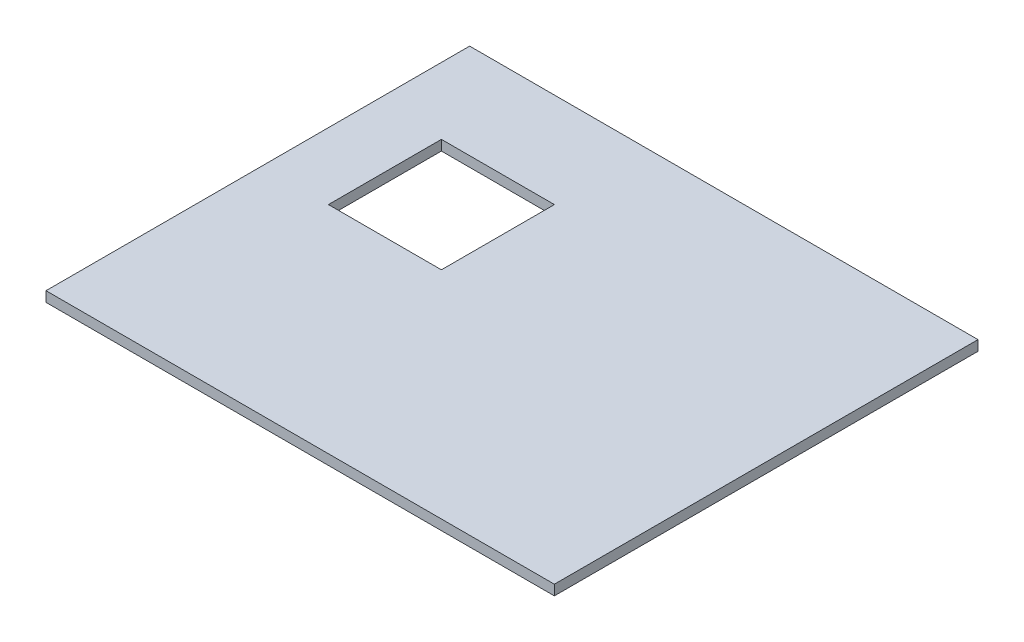
ISO-10303-21;
HEADER;
FILE_DESCRIPTION(('STEP AP214'),'2;1');
FILE_NAME('part.step','',(''),(''),'','','');
FILE_SCHEMA(('AUTOMOTIVE_DESIGN { 1 0 10303 214 1 1 1 1 }'));
ENDSEC;
DATA;
#1=APPLICATION_CONTEXT('core data for automotive mechanical design processes');
#2=APPLICATION_PROTOCOL_DEFINITION('international standard','automotive_design',2000,#1);
#3=PRODUCT_CONTEXT('',#1,'mechanical');
#4=PRODUCT('Part','Part','',(#3));
#5=PRODUCT_RELATED_PRODUCT_CATEGORY('part','',(#4));
#6=PRODUCT_DEFINITION_FORMATION('','',#4);
#7=PRODUCT_DEFINITION_CONTEXT('part definition',#1,'design');
#8=PRODUCT_DEFINITION('design','',#6,#7);
#9=PRODUCT_DEFINITION_SHAPE('','',#8);
#10=(LENGTH_UNIT() NAMED_UNIT(*) SI_UNIT(.MILLI.,.METRE.));
#11=(NAMED_UNIT(*) PLANE_ANGLE_UNIT() SI_UNIT($,.RADIAN.));
#12=(NAMED_UNIT(*) SI_UNIT($,.STERADIAN.) SOLID_ANGLE_UNIT());
#13=UNCERTAINTY_MEASURE_WITH_UNIT(LENGTH_MEASURE(1.E-05),#10,'distance_accuracy_value','');
#14=(GEOMETRIC_REPRESENTATION_CONTEXT(3) GLOBAL_UNCERTAINTY_ASSIGNED_CONTEXT((#13)) GLOBAL_UNIT_ASSIGNED_CONTEXT((#10,
#11,#12)) REPRESENTATION_CONTEXT('',''));
#15=CARTESIAN_POINT('',(0.,0.,0.));
#16=DIRECTION('',(0.,0.,1.));
#17=DIRECTION('',(1.,0.,0.));
#18=AXIS2_PLACEMENT_3D('',#15,#16,#17);
#19=CARTESIAN_POINT('',(0.,18.25625,0.));
#20=DIRECTION('',(0.,-1.,0.));
#21=DIRECTION('',(0.,0.,-1.));
#22=AXIS2_PLACEMENT_3D('',#19,#20,#21);
#23=PLANE('',#22);
#24=DIRECTION('',(0.,0.,-1.));
#25=VECTOR('',#24,1.);
#26=CARTESIAN_POINT('',(457.2,18.25625,381.));
#27=LINE('',#26,#25);
#28=CARTESIAN_POINT('',(457.2,18.25625,381.));
#29=VERTEX_POINT('',#28);
#30=CARTESIAN_POINT('',(457.2,18.25625,-381.));
#31=VERTEX_POINT('',#30);
#32=EDGE_CURVE('E153',#29,#31,#27,.T.);
#33=ORIENTED_EDGE('',*,*,#32,.T.);
#34=DIRECTION('',(-1.,0.,0.));
#35=VECTOR('',#34,1.);
#36=CARTESIAN_POINT('',(-457.2,18.25625,-381.));
#37=LINE('',#36,#35);
#38=CARTESIAN_POINT('',(-457.2,18.25625,-381.));
#39=VERTEX_POINT('',#38);
#40=EDGE_CURVE('E157',#31,#39,#37,.T.);
#41=ORIENTED_EDGE('',*,*,#40,.T.);
#42=DIRECTION('',(0.,0.,1.));
#43=VECTOR('',#42,1.);
#44=CARTESIAN_POINT('',(-457.2,18.25625,381.));
#45=LINE('',#44,#43);
#46=CARTESIAN_POINT('',(-457.2,18.25625,381.));
#47=VERTEX_POINT('',#46);
#48=EDGE_CURVE('E161',#39,#47,#45,.T.);
#49=ORIENTED_EDGE('',*,*,#48,.T.);
#50=DIRECTION('',(1.,0.,0.));
#51=VECTOR('',#50,1.);
#52=CARTESIAN_POINT('',(-457.2,18.25625,381.));
#53=LINE('',#52,#51);
#54=EDGE_CURVE('E164',#47,#29,#53,.T.);
#55=ORIENTED_EDGE('',*,*,#54,.T.);
#56=EDGE_LOOP('',(#33,#41,#49,#55));
#57=FACE_BOUND('',#56,.T.);
#58=DIRECTION('',(0.,0.,-1.));
#59=VECTOR('',#58,1.);
#60=CARTESIAN_POINT('',(-134.112,18.25625,-210.34375));
#61=LINE('',#60,#59);
#62=CARTESIAN_POINT('',(-134.112,18.25625,-7.14374999999999));
#63=VERTEX_POINT('',#62);
#64=CARTESIAN_POINT('',(-134.112,18.25625,-210.34375));
#65=VERTEX_POINT('',#64);
#66=EDGE_CURVE('E105',#63,#65,#61,.T.);
#67=ORIENTED_EDGE('',*,*,#66,.F.);
#68=DIRECTION('',(1.,0.,0.));
#69=VECTOR('',#68,1.);
#70=CARTESIAN_POINT('',(-337.312,18.25625,-7.14374999999999));
#71=LINE('',#70,#69);
#72=CARTESIAN_POINT('',(-337.312,18.25625,-7.14374999999999));
#73=VERTEX_POINT('',#72);
#74=EDGE_CURVE('E131',#73,#63,#71,.T.);
#75=ORIENTED_EDGE('',*,*,#74,.F.);
#76=DIRECTION('',(0.,0.,1.));
#77=VECTOR('',#76,1.);
#78=CARTESIAN_POINT('',(-337.312,18.25625,-210.34375));
#79=LINE('',#78,#77);
#80=CARTESIAN_POINT('',(-337.312,18.25625,-210.34375));
#81=VERTEX_POINT('',#80);
#82=EDGE_CURVE('E127',#81,#73,#79,.T.);
#83=ORIENTED_EDGE('',*,*,#82,.F.);
#84=DIRECTION('',(-1.,0.,0.));
#85=VECTOR('',#84,1.);
#86=CARTESIAN_POINT('',(-337.312,18.25625,-210.34375));
#87=LINE('',#86,#85);
#88=EDGE_CURVE('E114',#65,#81,#87,.T.);
#89=ORIENTED_EDGE('',*,*,#88,.F.);
#90=EDGE_LOOP('',(#67,#75,#83,#89));
#91=FACE_BOUND('',#90,.T.);
#92=ADVANCED_FACE('F39',(#57,#91),#23,.F.);
#93=CARTESIAN_POINT('',(0.,0.,0.));
#94=DIRECTION('',(0.,-1.,0.));
#95=DIRECTION('',(0.,0.,-1.));
#96=AXIS2_PLACEMENT_3D('',#93,#94,#95);
#97=PLANE('',#96);
#98=DIRECTION('',(0.,0.,-1.));
#99=VECTOR('',#98,1.);
#100=CARTESIAN_POINT('',(457.2,0.,381.));
#101=LINE('',#100,#99);
#102=CARTESIAN_POINT('',(457.2,0.,381.));
#103=VERTEX_POINT('',#102);
#104=CARTESIAN_POINT('',(457.2,0.,-381.));
#105=VERTEX_POINT('',#104);
#106=EDGE_CURVE('E123',#103,#105,#101,.T.);
#107=ORIENTED_EDGE('',*,*,#106,.F.);
#108=DIRECTION('',(1.,0.,0.));
#109=VECTOR('',#108,1.);
#110=CARTESIAN_POINT('',(-457.2,0.,381.));
#111=LINE('',#110,#109);
#112=CARTESIAN_POINT('',(-457.2,0.,381.));
#113=VERTEX_POINT('',#112);
#114=EDGE_CURVE('E158',#113,#103,#111,.T.);
#115=ORIENTED_EDGE('',*,*,#114,.F.);
#116=DIRECTION('',(0.,0.,1.));
#117=VECTOR('',#116,1.);
#118=CARTESIAN_POINT('',(-457.2,0.,381.));
#119=LINE('',#118,#117);
#120=CARTESIAN_POINT('',(-457.2,0.,-381.));
#121=VERTEX_POINT('',#120);
#122=EDGE_CURVE('E174',#121,#113,#119,.T.);
#123=ORIENTED_EDGE('',*,*,#122,.F.);
#124=DIRECTION('',(-1.,0.,0.));
#125=VECTOR('',#124,1.);
#126=CARTESIAN_POINT('',(-457.2,0.,-381.));
#127=LINE('',#126,#125);
#128=EDGE_CURVE('E171',#105,#121,#127,.T.);
#129=ORIENTED_EDGE('',*,*,#128,.F.);
#130=EDGE_LOOP('',(#107,#115,#123,#129));
#131=FACE_BOUND('',#130,.T.);
#132=DIRECTION('',(1.,0.,0.));
#133=VECTOR('',#132,1.);
#134=CARTESIAN_POINT('',(-337.312,0.,-7.14374999999999));
#135=LINE('',#134,#133);
#136=CARTESIAN_POINT('',(-337.312,0.,-7.14374999999999));
#137=VERTEX_POINT('',#136);
#138=CARTESIAN_POINT('',(-134.112,0.,-7.14374999999999));
#139=VERTEX_POINT('',#138);
#140=EDGE_CURVE('E115',#137,#139,#135,.T.);
#141=ORIENTED_EDGE('',*,*,#140,.T.);
#142=DIRECTION('',(0.,0.,-1.));
#143=VECTOR('',#142,1.);
#144=CARTESIAN_POINT('',(-134.112,0.,-210.34375));
#145=LINE('',#144,#143);
#146=CARTESIAN_POINT('',(-134.112,0.,-210.34375));
#147=VERTEX_POINT('',#146);
#148=EDGE_CURVE('E63',#139,#147,#145,.T.);
#149=ORIENTED_EDGE('',*,*,#148,.T.);
#150=DIRECTION('',(-1.,0.,0.));
#151=VECTOR('',#150,1.);
#152=CARTESIAN_POINT('',(-337.312,0.,-210.34375));
#153=LINE('',#152,#151);
#154=CARTESIAN_POINT('',(-337.312,0.,-210.34375));
#155=VERTEX_POINT('',#154);
#156=EDGE_CURVE('E121',#147,#155,#153,.T.);
#157=ORIENTED_EDGE('',*,*,#156,.T.);
#158=DIRECTION('',(0.,0.,1.));
#159=VECTOR('',#158,1.);
#160=CARTESIAN_POINT('',(-337.312,0.,-210.34375));
#161=LINE('',#160,#159);
#162=EDGE_CURVE('E140',#155,#137,#161,.T.);
#163=ORIENTED_EDGE('',*,*,#162,.T.);
#164=EDGE_LOOP('',(#141,#149,#157,#163));
#165=FACE_BOUND('',#164,.T.);
#166=ADVANCED_FACE('F197',(#131,#165),#97,.T.);
#167=CARTESIAN_POINT('',(457.2,18.25625,381.));
#168=DIRECTION('',(-1.,0.,0.));
#169=DIRECTION('',(0.,0.,1.));
#170=AXIS2_PLACEMENT_3D('',#167,#168,#169);
#171=PLANE('',#170);
#172=ORIENTED_EDGE('',*,*,#106,.T.);
#173=DIRECTION('',(0.,-1.,0.));
#174=VECTOR('',#173,1.);
#175=CARTESIAN_POINT('',(457.2,18.25625,-381.));
#176=LINE('',#175,#174);
#177=EDGE_CURVE('E11',#31,#105,#176,.T.);
#178=ORIENTED_EDGE('',*,*,#177,.F.);
#179=ORIENTED_EDGE('',*,*,#32,.F.);
#180=DIRECTION('',(0.,-1.,0.));
#181=VECTOR('',#180,1.);
#182=CARTESIAN_POINT('',(457.2,18.25625,381.));
#183=LINE('',#182,#181);
#184=EDGE_CURVE('E167',#29,#103,#183,.T.);
#185=ORIENTED_EDGE('',*,*,#184,.T.);
#186=EDGE_LOOP('',(#172,#178,#179,#185));
#187=FACE_BOUND('',#186,.T.);
#188=ADVANCED_FACE('F41',(#187),#171,.F.);
#189=CARTESIAN_POINT('',(-457.2,18.25625,-381.));
#190=DIRECTION('',(0.,0.,1.));
#191=DIRECTION('',(1.,0.,0.));
#192=AXIS2_PLACEMENT_3D('',#189,#190,#191);
#193=PLANE('',#192);
#194=ORIENTED_EDGE('',*,*,#128,.T.);
#195=DIRECTION('',(0.,-1.,0.));
#196=VECTOR('',#195,1.);
#197=CARTESIAN_POINT('',(-457.2,18.25625,-381.));
#198=LINE('',#197,#196);
#199=EDGE_CURVE('E48',#39,#121,#198,.T.);
#200=ORIENTED_EDGE('',*,*,#199,.F.);
#201=ORIENTED_EDGE('',*,*,#40,.F.);
#202=ORIENTED_EDGE('',*,*,#177,.T.);
#203=EDGE_LOOP('',(#194,#200,#201,#202));
#204=FACE_BOUND('',#203,.T.);
#205=ADVANCED_FACE('F207',(#204),#193,.F.);
#206=CARTESIAN_POINT('',(-457.2,18.25625,381.));
#207=DIRECTION('',(1.,0.,0.));
#208=DIRECTION('',(0.,0.,-1.));
#209=AXIS2_PLACEMENT_3D('',#206,#207,#208);
#210=PLANE('',#209);
#211=ORIENTED_EDGE('',*,*,#122,.T.);
#212=DIRECTION('',(0.,-1.,0.));
#213=VECTOR('',#212,1.);
#214=CARTESIAN_POINT('',(-457.2,18.25625,381.));
#215=LINE('',#214,#213);
#216=EDGE_CURVE('E182',#47,#113,#215,.T.);
#217=ORIENTED_EDGE('',*,*,#216,.F.);
#218=ORIENTED_EDGE('',*,*,#48,.F.);
#219=ORIENTED_EDGE('',*,*,#199,.T.);
#220=EDGE_LOOP('',(#211,#217,#218,#219));
#221=FACE_BOUND('',#220,.T.);
#222=ADVANCED_FACE('F191',(#221),#210,.F.);
#223=CARTESIAN_POINT('',(-457.2,18.25625,381.));
#224=DIRECTION('',(0.,0.,-1.));
#225=DIRECTION('',(-1.,0.,0.));
#226=AXIS2_PLACEMENT_3D('',#223,#224,#225);
#227=PLANE('',#226);
#228=ORIENTED_EDGE('',*,*,#114,.T.);
#229=ORIENTED_EDGE('',*,*,#184,.F.);
#230=ORIENTED_EDGE('',*,*,#54,.F.);
#231=ORIENTED_EDGE('',*,*,#216,.T.);
#232=EDGE_LOOP('',(#228,#229,#230,#231));
#233=FACE_BOUND('',#232,.T.);
#234=ADVANCED_FACE('F201',(#233),#227,.F.);
#235=CARTESIAN_POINT('',(-134.112,18.25625,-210.34375));
#236=DIRECTION('',(-1.,0.,0.));
#237=DIRECTION('',(0.,0.,1.));
#238=AXIS2_PLACEMENT_3D('',#235,#236,#237);
#239=PLANE('',#238);
#240=ORIENTED_EDGE('',*,*,#148,.F.);
#241=DIRECTION('',(0.,-1.,0.));
#242=VECTOR('',#241,1.);
#243=CARTESIAN_POINT('',(-134.112,18.25625,-7.14374999999999));
#244=LINE('',#243,#242);
#245=EDGE_CURVE('E109',#63,#139,#244,.T.);
#246=ORIENTED_EDGE('',*,*,#245,.F.);
#247=ORIENTED_EDGE('',*,*,#66,.T.);
#248=DIRECTION('',(0.,-1.,0.));
#249=VECTOR('',#248,1.);
#250=CARTESIAN_POINT('',(-134.112,18.25625,-210.34375));
#251=LINE('',#250,#249);
#252=EDGE_CURVE('E108',#65,#147,#251,.T.);
#253=ORIENTED_EDGE('',*,*,#252,.T.);
#254=EDGE_LOOP('',(#240,#246,#247,#253));
#255=FACE_BOUND('',#254,.T.);
#256=ADVANCED_FACE('F107',(#255),#239,.T.);
#257=CARTESIAN_POINT('',(-337.312,18.25625,-210.34375));
#258=DIRECTION('',(0.,0.,1.));
#259=DIRECTION('',(1.,0.,0.));
#260=AXIS2_PLACEMENT_3D('',#257,#258,#259);
#261=PLANE('',#260);
#262=ORIENTED_EDGE('',*,*,#156,.F.);
#263=ORIENTED_EDGE('',*,*,#252,.F.);
#264=ORIENTED_EDGE('',*,*,#88,.T.);
#265=DIRECTION('',(0.,-1.,0.));
#266=VECTOR('',#265,1.);
#267=CARTESIAN_POINT('',(-337.312,18.25625,-210.34375));
#268=LINE('',#267,#266);
#269=EDGE_CURVE('E124',#81,#155,#268,.T.);
#270=ORIENTED_EDGE('',*,*,#269,.T.);
#271=EDGE_LOOP('',(#262,#263,#264,#270));
#272=FACE_BOUND('',#271,.T.);
#273=ADVANCED_FACE('F118',(#272),#261,.T.);
#274=CARTESIAN_POINT('',(-337.312,18.25625,-210.34375));
#275=DIRECTION('',(1.,0.,0.));
#276=DIRECTION('',(0.,0.,-1.));
#277=AXIS2_PLACEMENT_3D('',#274,#275,#276);
#278=PLANE('',#277);
#279=ORIENTED_EDGE('',*,*,#162,.F.);
#280=ORIENTED_EDGE('',*,*,#269,.F.);
#281=ORIENTED_EDGE('',*,*,#82,.T.);
#282=DIRECTION('',(0.,-1.,0.));
#283=VECTOR('',#282,1.);
#284=CARTESIAN_POINT('',(-337.312,18.25625,-7.14374999999999));
#285=LINE('',#284,#283);
#286=EDGE_CURVE('E55',#73,#137,#285,.T.);
#287=ORIENTED_EDGE('',*,*,#286,.T.);
#288=EDGE_LOOP('',(#279,#280,#281,#287));
#289=FACE_BOUND('',#288,.T.);
#290=ADVANCED_FACE('F230',(#289),#278,.T.);
#291=CARTESIAN_POINT('',(-337.312,18.25625,-7.14374999999999));
#292=DIRECTION('',(0.,0.,-1.));
#293=DIRECTION('',(-1.,0.,0.));
#294=AXIS2_PLACEMENT_3D('',#291,#292,#293);
#295=PLANE('',#294);
#296=ORIENTED_EDGE('',*,*,#140,.F.);
#297=ORIENTED_EDGE('',*,*,#286,.F.);
#298=ORIENTED_EDGE('',*,*,#74,.T.);
#299=ORIENTED_EDGE('',*,*,#245,.T.);
#300=EDGE_LOOP('',(#296,#297,#298,#299));
#301=FACE_BOUND('',#300,.T.);
#302=ADVANCED_FACE('F234',(#301),#295,.T.);
#303=CLOSED_SHELL('',(#92,#166,#188,#205,#222,#234,#256,#273,#290,#302));
#304=MANIFOLD_SOLID_BREP('B2',#303);
#305=ADVANCED_BREP_SHAPE_REPRESENTATION('',(#18,#304),#14);
#306=SHAPE_DEFINITION_REPRESENTATION(#9,#305);
ENDSEC;
END-ISO-10303-21;
